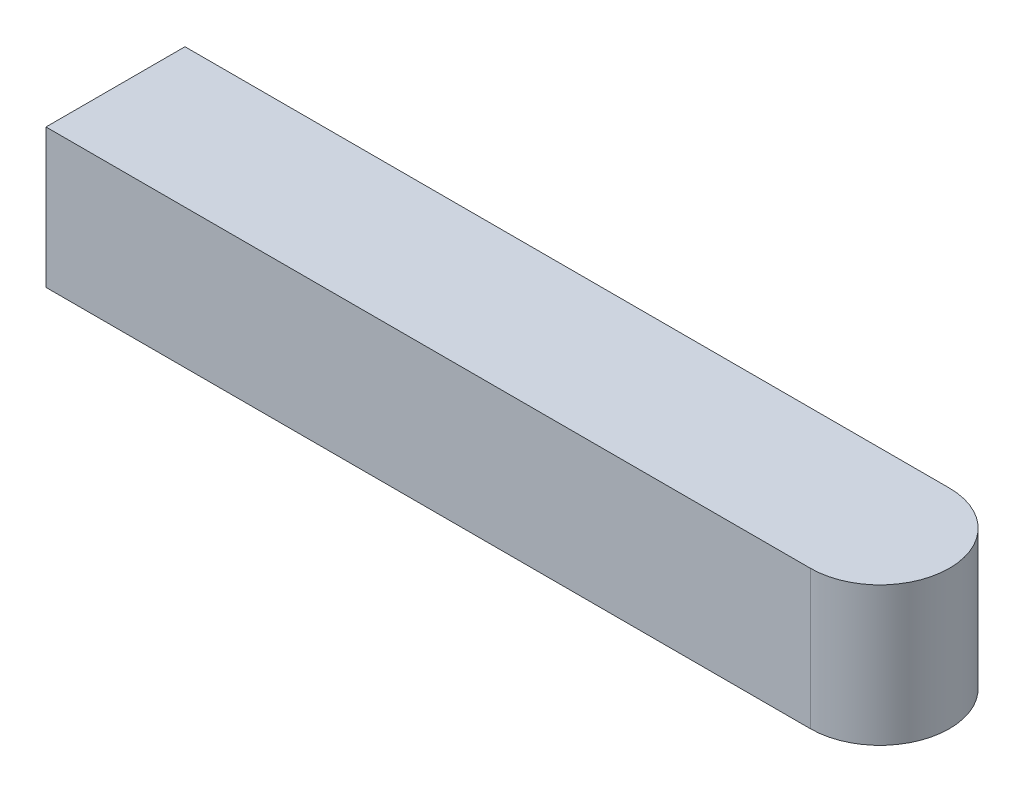
ISO-10303-21;
HEADER;
FILE_DESCRIPTION(('STEP AP214'),'2;1');
FILE_NAME('part.step','',(''),(''),'','','');
FILE_SCHEMA(('AUTOMOTIVE_DESIGN { 1 0 10303 214 1 1 1 1 }'));
ENDSEC;
DATA;
#1=APPLICATION_CONTEXT('core data for automotive mechanical design processes');
#2=APPLICATION_PROTOCOL_DEFINITION('international standard','automotive_design',2000,#1);
#3=PRODUCT_CONTEXT('',#1,'mechanical');
#4=PRODUCT('Part','Part','',(#3));
#5=PRODUCT_RELATED_PRODUCT_CATEGORY('part','',(#4));
#6=PRODUCT_DEFINITION_FORMATION('','',#4);
#7=PRODUCT_DEFINITION_CONTEXT('part definition',#1,'design');
#8=PRODUCT_DEFINITION('design','',#6,#7);
#9=PRODUCT_DEFINITION_SHAPE('','',#8);
#10=(LENGTH_UNIT() NAMED_UNIT(*) SI_UNIT(.MILLI.,.METRE.));
#11=(NAMED_UNIT(*) PLANE_ANGLE_UNIT() SI_UNIT($,.RADIAN.));
#12=(NAMED_UNIT(*) SI_UNIT($,.STERADIAN.) SOLID_ANGLE_UNIT());
#13=UNCERTAINTY_MEASURE_WITH_UNIT(LENGTH_MEASURE(1.E-05),#10,'distance_accuracy_value','');
#14=(GEOMETRIC_REPRESENTATION_CONTEXT(3) GLOBAL_UNCERTAINTY_ASSIGNED_CONTEXT((#13)) GLOBAL_UNIT_ASSIGNED_CONTEXT((#10,
#11,#12)) REPRESENTATION_CONTEXT('',''));
#15=CARTESIAN_POINT('',(0.,0.,0.));
#16=DIRECTION('',(0.,0.,1.));
#17=DIRECTION('',(1.,0.,0.));
#18=AXIS2_PLACEMENT_3D('',#15,#16,#17);
#19=CARTESIAN_POINT('',(-13.75,2.5,-2.5));
#20=DIRECTION('',(1.,0.,0.));
#21=DIRECTION('',(0.,0.,-1.));
#22=AXIS2_PLACEMENT_3D('',#19,#20,#21);
#23=PLANE('',#22);
#24=DIRECTION('',(0.,0.,1.));
#25=VECTOR('',#24,1.);
#26=CARTESIAN_POINT('',(-13.75,-2.5,-2.5));
#27=LINE('',#26,#25);
#28=CARTESIAN_POINT('',(-13.75,-2.5,-2.5));
#29=VERTEX_POINT('',#28);
#30=CARTESIAN_POINT('',(-13.75,-2.5,2.5));
#31=VERTEX_POINT('',#30);
#32=EDGE_CURVE('E97',#29,#31,#27,.T.);
#33=ORIENTED_EDGE('',*,*,#32,.T.);
#34=DIRECTION('',(0.,-1.,0.));
#35=VECTOR('',#34,1.);
#36=CARTESIAN_POINT('',(-13.75,2.5,2.5));
#37=LINE('',#36,#35);
#38=CARTESIAN_POINT('',(-13.75,2.5,2.5));
#39=VERTEX_POINT('',#38);
#40=EDGE_CURVE('E11',#39,#31,#37,.T.);
#41=ORIENTED_EDGE('',*,*,#40,.F.);
#42=DIRECTION('',(0.,0.,1.));
#43=VECTOR('',#42,1.);
#44=CARTESIAN_POINT('',(-13.75,2.5,-2.5));
#45=LINE('',#44,#43);
#46=CARTESIAN_POINT('',(-13.75,2.5,-2.5));
#47=VERTEX_POINT('',#46);
#48=EDGE_CURVE('E85',#47,#39,#45,.T.);
#49=ORIENTED_EDGE('',*,*,#48,.F.);
#50=DIRECTION('',(0.,-1.,0.));
#51=VECTOR('',#50,1.);
#52=CARTESIAN_POINT('',(-13.75,2.5,-2.5));
#53=LINE('',#52,#51);
#54=EDGE_CURVE('E93',#47,#29,#53,.T.);
#55=ORIENTED_EDGE('',*,*,#54,.T.);
#56=EDGE_LOOP('',(#33,#41,#49,#55));
#57=FACE_BOUND('',#56,.T.);
#58=ADVANCED_FACE('F34',(#57),#23,.F.);
#59=CARTESIAN_POINT('',(-13.75,2.5,2.5));
#60=DIRECTION('',(0.,0.,-1.));
#61=DIRECTION('',(-1.,0.,0.));
#62=AXIS2_PLACEMENT_3D('',#59,#60,#61);
#63=PLANE('',#62);
#64=DIRECTION('',(1.,0.,0.));
#65=VECTOR('',#64,1.);
#66=CARTESIAN_POINT('',(-13.75,-2.5,2.5));
#67=LINE('',#66,#65);
#68=CARTESIAN_POINT('',(13.75,-2.5,2.5));
#69=VERTEX_POINT('',#68);
#70=EDGE_CURVE('E89',#31,#69,#67,.T.);
#71=ORIENTED_EDGE('',*,*,#70,.T.);
#72=DIRECTION('',(0.,-1.,0.));
#73=VECTOR('',#72,1.);
#74=CARTESIAN_POINT('',(13.75,2.5,2.5));
#75=LINE('',#74,#73);
#76=CARTESIAN_POINT('',(13.75,2.5,2.5));
#77=VERTEX_POINT('',#76);
#78=EDGE_CURVE('E42',#77,#69,#75,.T.);
#79=ORIENTED_EDGE('',*,*,#78,.F.);
#80=DIRECTION('',(1.,0.,0.));
#81=VECTOR('',#80,1.);
#82=CARTESIAN_POINT('',(-13.75,2.5,2.5));
#83=LINE('',#82,#81);
#84=EDGE_CURVE('E80',#39,#77,#83,.T.);
#85=ORIENTED_EDGE('',*,*,#84,.F.);
#86=ORIENTED_EDGE('',*,*,#40,.T.);
#87=EDGE_LOOP('',(#71,#79,#85,#86));
#88=FACE_BOUND('',#87,.T.);
#89=ADVANCED_FACE('F88',(#88),#63,.F.);
#90=CARTESIAN_POINT('',(13.75,2.5,0.));
#91=DIRECTION('',(0.,-1.,0.));
#92=DIRECTION('',(0.,0.,-1.));
#93=AXIS2_PLACEMENT_3D('',#90,#91,#92);
#94=CYLINDRICAL_SURFACE('',#93,2.5);
#95=CARTESIAN_POINT('',(13.75,-2.5,0.));
#96=DIRECTION('',(0.,1.,0.));
#97=DIRECTION('',(0.,0.,1.));
#98=AXIS2_PLACEMENT_3D('',#95,#96,#97);
#99=CIRCLE('',#98,2.5);
#100=CARTESIAN_POINT('',(13.75,-2.5,-2.5));
#101=VERTEX_POINT('',#100);
#102=EDGE_CURVE('E67',#69,#101,#99,.T.);
#103=ORIENTED_EDGE('',*,*,#102,.T.);
#104=DIRECTION('',(0.,-1.,0.));
#105=VECTOR('',#104,1.);
#106=CARTESIAN_POINT('',(13.75,2.5,-2.5));
#107=LINE('',#106,#105);
#108=CARTESIAN_POINT('',(13.75,2.5,-2.5));
#109=VERTEX_POINT('',#108);
#110=EDGE_CURVE('E90',#109,#101,#107,.T.);
#111=ORIENTED_EDGE('',*,*,#110,.F.);
#112=CARTESIAN_POINT('',(13.75,2.5,0.));
#113=DIRECTION('',(0.,1.,0.));
#114=DIRECTION('',(0.,0.,1.));
#115=AXIS2_PLACEMENT_3D('',#112,#113,#114);
#116=CIRCLE('',#115,2.5);
#117=EDGE_CURVE('E83',#77,#109,#116,.T.);
#118=ORIENTED_EDGE('',*,*,#117,.F.);
#119=ORIENTED_EDGE('',*,*,#78,.T.);
#120=EDGE_LOOP('',(#103,#111,#118,#119));
#121=FACE_BOUND('',#120,.T.);
#122=ADVANCED_FACE('F91',(#121),#94,.T.);
#123=CARTESIAN_POINT('',(-13.75,2.5,-2.5));
#124=DIRECTION('',(0.,0.,1.));
#125=DIRECTION('',(1.,0.,0.));
#126=AXIS2_PLACEMENT_3D('',#123,#124,#125);
#127=PLANE('',#126);
#128=DIRECTION('',(-1.,0.,0.));
#129=VECTOR('',#128,1.);
#130=CARTESIAN_POINT('',(-13.75,-2.5,-2.5));
#131=LINE('',#130,#129);
#132=EDGE_CURVE('E73',#101,#29,#131,.T.);
#133=ORIENTED_EDGE('',*,*,#132,.T.);
#134=ORIENTED_EDGE('',*,*,#54,.F.);
#135=DIRECTION('',(-1.,0.,0.));
#136=VECTOR('',#135,1.);
#137=CARTESIAN_POINT('',(-13.75,2.5,-2.5));
#138=LINE('',#137,#136);
#139=EDGE_CURVE('E50',#109,#47,#138,.T.);
#140=ORIENTED_EDGE('',*,*,#139,.F.);
#141=ORIENTED_EDGE('',*,*,#110,.T.);
#142=EDGE_LOOP('',(#133,#134,#140,#141));
#143=FACE_BOUND('',#142,.T.);
#144=ADVANCED_FACE('F104',(#143),#127,.F.);
#145=CARTESIAN_POINT('',(13.75,2.5,0.));
#146=DIRECTION('',(0.,1.,0.));
#147=DIRECTION('',(0.,0.,1.));
#148=AXIS2_PLACEMENT_3D('',#145,#146,#147);
#149=PLANE('',#148);
#150=ORIENTED_EDGE('',*,*,#48,.T.);
#151=ORIENTED_EDGE('',*,*,#84,.T.);
#152=ORIENTED_EDGE('',*,*,#117,.T.);
#153=ORIENTED_EDGE('',*,*,#139,.T.);
#154=EDGE_LOOP('',(#150,#151,#152,#153));
#155=FACE_BOUND('',#154,.T.);
#156=ADVANCED_FACE('F81',(#155),#149,.T.);
#157=CARTESIAN_POINT('',(13.75,-2.5,0.));
#158=DIRECTION('',(0.,1.,0.));
#159=DIRECTION('',(0.,0.,1.));
#160=AXIS2_PLACEMENT_3D('',#157,#158,#159);
#161=PLANE('',#160);
#162=ORIENTED_EDGE('',*,*,#32,.F.);
#163=ORIENTED_EDGE('',*,*,#132,.F.);
#164=ORIENTED_EDGE('',*,*,#102,.F.);
#165=ORIENTED_EDGE('',*,*,#70,.F.);
#166=EDGE_LOOP('',(#162,#163,#164,#165));
#167=FACE_BOUND('',#166,.T.);
#168=ADVANCED_FACE('F107',(#167),#161,.F.);
#169=CLOSED_SHELL('',(#58,#89,#122,#144,#156,#168));
#170=MANIFOLD_SOLID_BREP('B2',#169);
#171=ADVANCED_BREP_SHAPE_REPRESENTATION('',(#18,#170),#14);
#172=SHAPE_DEFINITION_REPRESENTATION(#9,#171);
ENDSEC;
END-ISO-10303-21;
